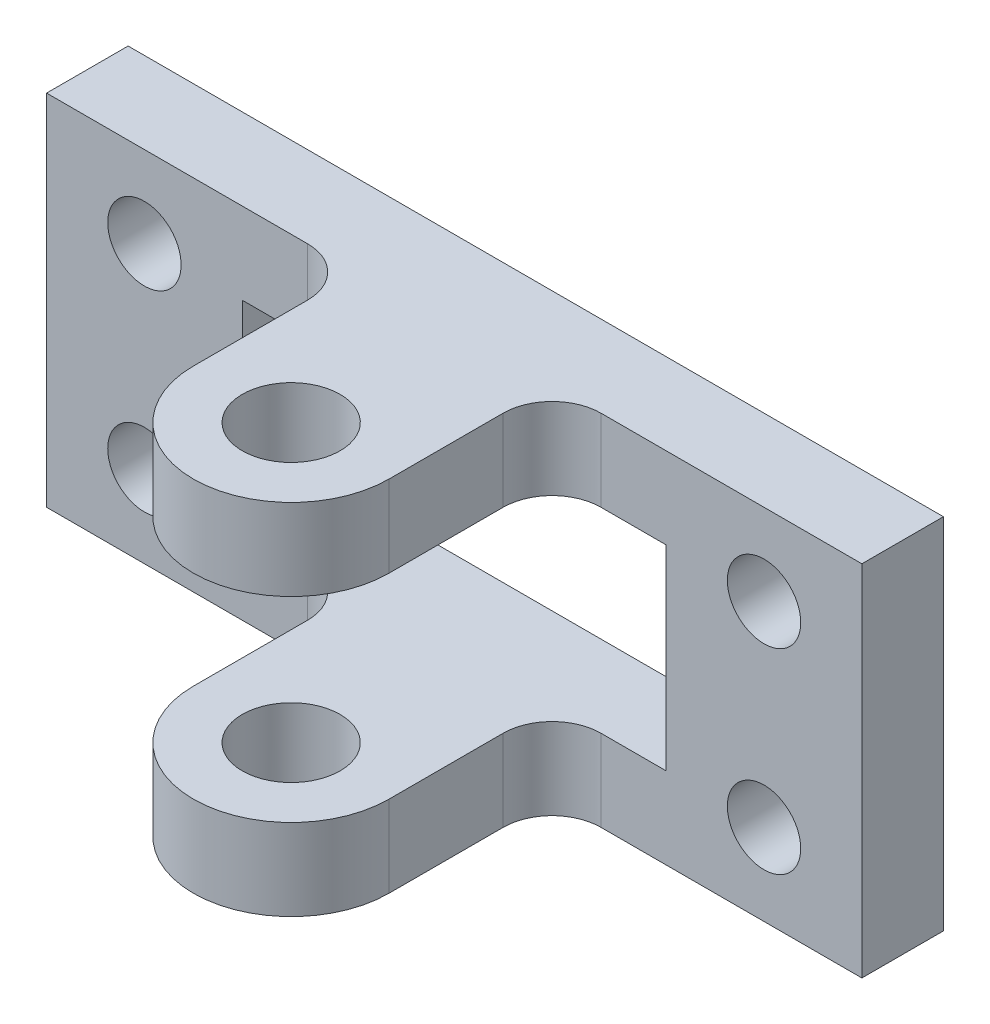
ISO-10303-21;
HEADER;
FILE_DESCRIPTION(('STEP AP214'),'2;1');
FILE_NAME('part.step','',(''),(''),'','','');
FILE_SCHEMA(('AUTOMOTIVE_DESIGN { 1 0 10303 214 1 1 1 1 }'));
ENDSEC;
DATA;
#1=APPLICATION_CONTEXT('core data for automotive mechanical design processes');
#2=APPLICATION_PROTOCOL_DEFINITION('international standard','automotive_design',2000,#1);
#3=PRODUCT_CONTEXT('',#1,'mechanical');
#4=PRODUCT('Part','Part','',(#3));
#5=PRODUCT_RELATED_PRODUCT_CATEGORY('part','',(#4));
#6=PRODUCT_DEFINITION_FORMATION('','',#4);
#7=PRODUCT_DEFINITION_CONTEXT('part definition',#1,'design');
#8=PRODUCT_DEFINITION('design','',#6,#7);
#9=PRODUCT_DEFINITION_SHAPE('','',#8);
#10=(LENGTH_UNIT() NAMED_UNIT(*) SI_UNIT(.MILLI.,.METRE.));
#11=(NAMED_UNIT(*) PLANE_ANGLE_UNIT() SI_UNIT($,.RADIAN.));
#12=(NAMED_UNIT(*) SI_UNIT($,.STERADIAN.) SOLID_ANGLE_UNIT());
#13=UNCERTAINTY_MEASURE_WITH_UNIT(LENGTH_MEASURE(1.E-05),#10,'distance_accuracy_value','');
#14=(GEOMETRIC_REPRESENTATION_CONTEXT(3) GLOBAL_UNCERTAINTY_ASSIGNED_CONTEXT((#13)) GLOBAL_UNIT_ASSIGNED_CONTEXT((#10,
#11,#12)) REPRESENTATION_CONTEXT('',''));
#15=CARTESIAN_POINT('',(0.,0.,0.));
#16=DIRECTION('',(0.,0.,1.));
#17=DIRECTION('',(1.,0.,0.));
#18=AXIS2_PLACEMENT_3D('',#15,#16,#17);
#19=CARTESIAN_POINT('',(6.,-6.,15.));
#20=DIRECTION('',(0.,1.,0.));
#21=DIRECTION('',(0.,0.,1.));
#22=AXIS2_PLACEMENT_3D('',#19,#20,#21);
#23=PLANE('',#22);
#24=CARTESIAN_POINT('',(0.,-6.,15.));
#25=DIRECTION('',(0.,1.,0.));
#26=DIRECTION('',(0.,0.,1.));
#27=AXIS2_PLACEMENT_3D('',#24,#25,#26);
#28=CIRCLE('',#27,2.99999999999999);
#29=CARTESIAN_POINT('',(0.,-6.,18.));
#30=VERTEX_POINT('',#29);
#31=EDGE_CURVE('E301',#30,#30,#28,.T.);
#32=ORIENTED_EDGE('',*,*,#31,.F.);
#33=EDGE_LOOP('',(#32));
#34=FACE_BOUND('',#33,.T.);
#35=DIRECTION('',(1.,0.,0.));
#36=VECTOR('',#35,1.);
#37=CARTESIAN_POINT('',(5.9999999999999,-6.,0.));
#38=LINE('',#37,#36);
#39=CARTESIAN_POINT('',(-13.,-6.,0.));
#40=VERTEX_POINT('',#39);
#41=CARTESIAN_POINT('',(13.,-6.,0.));
#42=VERTEX_POINT('',#41);
#43=EDGE_CURVE('E276',#40,#42,#38,.T.);
#44=ORIENTED_EDGE('',*,*,#43,.F.);
#45=DIRECTION('',(0.,0.,-1.));
#46=VECTOR('',#45,1.);
#47=CARTESIAN_POINT('',(-13.,-6.,0.));
#48=LINE('',#47,#46);
#49=CARTESIAN_POINT('',(-13.,-6.,5.));
#50=VERTEX_POINT('',#49);
#51=EDGE_CURVE('E192',#50,#40,#48,.T.);
#52=ORIENTED_EDGE('',*,*,#51,.F.);
#53=DIRECTION('',(1.,0.,0.));
#54=VECTOR('',#53,1.);
#55=CARTESIAN_POINT('',(-25.0000000000001,-6.,5.00000000000013));
#56=LINE('',#55,#54);
#57=CARTESIAN_POINT('',(-9.00000000000007,-6.,5.00000000000002));
#58=VERTEX_POINT('',#57);
#59=EDGE_CURVE('E270',#50,#58,#56,.T.);
#60=ORIENTED_EDGE('',*,*,#59,.T.);
#61=CARTESIAN_POINT('',(-9.00000000000005,-6.,8.00000000000002));
#62=DIRECTION('',(0.,1.,0.));
#63=DIRECTION('',(0.,0.,1.));
#64=AXIS2_PLACEMENT_3D('',#61,#62,#63);
#65=CIRCLE('',#64,3.);
#66=CARTESIAN_POINT('',(-6.00000000000005,-6.,8.));
#67=VERTEX_POINT('',#66);
#68=EDGE_CURVE('E340',#58,#67,#65,.F.);
#69=ORIENTED_EDGE('',*,*,#68,.T.);
#70=DIRECTION('',(0.,0.,1.));
#71=VECTOR('',#70,1.);
#72=CARTESIAN_POINT('',(-6.00000000000011,-6.,0.));
#73=LINE('',#72,#71);
#74=CARTESIAN_POINT('',(-6.,-6.,15.));
#75=VERTEX_POINT('',#74);
#76=EDGE_CURVE('E280',#67,#75,#73,.T.);
#77=ORIENTED_EDGE('',*,*,#76,.T.);
#78=CARTESIAN_POINT('',(0.,-6.,15.));
#79=DIRECTION('',(0.,-1.,0.));
#80=DIRECTION('',(0.,0.,-1.));
#81=AXIS2_PLACEMENT_3D('',#78,#79,#80);
#82=CIRCLE('',#81,6.);
#83=CARTESIAN_POINT('',(6.,-6.,15.));
#84=VERTEX_POINT('',#83);
#85=EDGE_CURVE('E297',#84,#75,#82,.T.);
#86=ORIENTED_EDGE('',*,*,#85,.F.);
#87=DIRECTION('',(0.,0.,1.));
#88=VECTOR('',#87,1.);
#89=CARTESIAN_POINT('',(5.9999999999999,-6.,0.));
#90=LINE('',#89,#88);
#91=CARTESIAN_POINT('',(5.99999999999995,-6.,8.));
#92=VERTEX_POINT('',#91);
#93=EDGE_CURVE('E286',#92,#84,#90,.T.);
#94=ORIENTED_EDGE('',*,*,#93,.F.);
#95=CARTESIAN_POINT('',(8.99999999999995,-6.,7.99999999999998));
#96=DIRECTION('',(0.,1.,0.));
#97=DIRECTION('',(0.,0.,1.));
#98=AXIS2_PLACEMENT_3D('',#95,#96,#97);
#99=CIRCLE('',#98,3.);
#100=CARTESIAN_POINT('',(8.99999999999993,-6.,4.99999999999998));
#101=VERTEX_POINT('',#100);
#102=EDGE_CURVE('E11',#92,#101,#99,.F.);
#103=ORIENTED_EDGE('',*,*,#102,.T.);
#104=DIRECTION('',(-1.,0.,0.));
#105=VECTOR('',#104,1.);
#106=CARTESIAN_POINT('',(24.9999999999999,-6.,4.99999999999987));
#107=LINE('',#106,#105);
#108=CARTESIAN_POINT('',(13.,-6.,5.));
#109=VERTEX_POINT('',#108);
#110=EDGE_CURVE('E260',#109,#101,#107,.T.);
#111=ORIENTED_EDGE('',*,*,#110,.F.);
#112=DIRECTION('',(0.,0.,1.));
#113=VECTOR('',#112,1.);
#114=CARTESIAN_POINT('',(13.,-6.,5.));
#115=LINE('',#114,#113);
#116=EDGE_CURVE('E239',#42,#109,#115,.T.);
#117=ORIENTED_EDGE('',*,*,#116,.F.);
#118=EDGE_LOOP('',(#44,#52,#60,#69,#77,#86,#94,#103,#111,#117));
#119=FACE_BOUND('',#118,.T.);
#120=ADVANCED_FACE('F36',(#34,#119),#23,.T.);
#121=CARTESIAN_POINT('',(5.9999999999999,-11.,0.));
#122=DIRECTION('',(-1.,0.,0.));
#123=DIRECTION('',(0.,0.,1.));
#124=AXIS2_PLACEMENT_3D('',#121,#122,#123);
#125=PLANE('',#124);
#126=DIRECTION('',(0.,0.,1.));
#127=VECTOR('',#126,1.);
#128=CARTESIAN_POINT('',(5.9999999999999,-11.,0.));
#129=LINE('',#128,#127);
#130=CARTESIAN_POINT('',(5.99999999999995,-11.,8.));
#131=VERTEX_POINT('',#130);
#132=CARTESIAN_POINT('',(6.,-11.,15.));
#133=VERTEX_POINT('',#132);
#134=EDGE_CURVE('E284',#131,#133,#129,.T.);
#135=ORIENTED_EDGE('',*,*,#134,.F.);
#136=DIRECTION('',(0.,-1.,0.));
#137=VECTOR('',#136,1.);
#138=CARTESIAN_POINT('',(5.99999999999995,-6.,8.));
#139=LINE('',#138,#137);
#140=EDGE_CURVE('E57',#131,#92,#139,.F.);
#141=ORIENTED_EDGE('',*,*,#140,.T.);
#142=ORIENTED_EDGE('',*,*,#93,.T.);
#143=DIRECTION('',(0.,1.,0.));
#144=VECTOR('',#143,1.);
#145=CARTESIAN_POINT('',(6.,-11.,15.));
#146=LINE('',#145,#144);
#147=EDGE_CURVE('E291',#133,#84,#146,.T.);
#148=ORIENTED_EDGE('',*,*,#147,.F.);
#149=EDGE_LOOP('',(#135,#141,#142,#148));
#150=FACE_BOUND('',#149,.T.);
#151=ADVANCED_FACE('F399',(#150),#125,.F.);
#152=CARTESIAN_POINT('',(-6.00000000000011,-6.,0.));
#153=DIRECTION('',(1.,0.,0.));
#154=DIRECTION('',(0.,0.,-1.));
#155=AXIS2_PLACEMENT_3D('',#152,#153,#154);
#156=PLANE('',#155);
#157=ORIENTED_EDGE('',*,*,#76,.F.);
#158=DIRECTION('',(0.,1.,0.));
#159=VECTOR('',#158,1.);
#160=CARTESIAN_POINT('',(-6.00000000000005,-11.,8.));
#161=LINE('',#160,#159);
#162=CARTESIAN_POINT('',(-6.00000000000005,-11.,8.));
#163=VERTEX_POINT('',#162);
#164=EDGE_CURVE('E330',#67,#163,#161,.F.);
#165=ORIENTED_EDGE('',*,*,#164,.T.);
#166=DIRECTION('',(0.,0.,1.));
#167=VECTOR('',#166,1.);
#168=CARTESIAN_POINT('',(-6.00000000000011,-11.,0.));
#169=LINE('',#168,#167);
#170=CARTESIAN_POINT('',(-6.,-11.,15.));
#171=VERTEX_POINT('',#170);
#172=EDGE_CURVE('E282',#163,#171,#169,.T.);
#173=ORIENTED_EDGE('',*,*,#172,.T.);
#174=DIRECTION('',(0.,1.,0.));
#175=VECTOR('',#174,1.);
#176=CARTESIAN_POINT('',(-6.,-11.,15.));
#177=LINE('',#176,#175);
#178=EDGE_CURVE('E288',#171,#75,#177,.T.);
#179=ORIENTED_EDGE('',*,*,#178,.T.);
#180=EDGE_LOOP('',(#157,#165,#173,#179));
#181=FACE_BOUND('',#180,.T.);
#182=ADVANCED_FACE('F363',(#181),#156,.F.);
#183=CARTESIAN_POINT('',(0.,-6.,15.));
#184=DIRECTION('',(0.,-1.,0.));
#185=DIRECTION('',(0.,0.,-1.));
#186=AXIS2_PLACEMENT_3D('',#183,#184,#185);
#187=CYLINDRICAL_SURFACE('',#186,6.);
#188=ORIENTED_EDGE('',*,*,#85,.T.);
#189=ORIENTED_EDGE('',*,*,#178,.F.);
#190=CARTESIAN_POINT('',(0.,-11.,15.));
#191=DIRECTION('',(0.,-1.,0.));
#192=DIRECTION('',(0.,0.,-1.));
#193=AXIS2_PLACEMENT_3D('',#190,#191,#192);
#194=CIRCLE('',#193,6.);
#195=EDGE_CURVE('E294',#133,#171,#194,.T.);
#196=ORIENTED_EDGE('',*,*,#195,.F.);
#197=ORIENTED_EDGE('',*,*,#147,.T.);
#198=EDGE_LOOP('',(#188,#189,#196,#197));
#199=FACE_BOUND('',#198,.T.);
#200=ADVANCED_FACE('F367',(#199),#187,.T.);
#201=CARTESIAN_POINT('',(0.,-11.,15.));
#202=DIRECTION('',(0.,-1.,0.));
#203=DIRECTION('',(0.,0.,-1.));
#204=AXIS2_PLACEMENT_3D('',#201,#202,#203);
#205=PLANE('',#204);
#206=CARTESIAN_POINT('',(0.,-11.,15.));
#207=DIRECTION('',(0.,-1.,0.));
#208=DIRECTION('',(0.,0.,-1.));
#209=AXIS2_PLACEMENT_3D('',#206,#207,#208);
#210=CIRCLE('',#209,2.99999999999999);
#211=CARTESIAN_POINT('',(0.,-11.,12.));
#212=VERTEX_POINT('',#211);
#213=EDGE_CURVE('E305',#212,#212,#210,.T.);
#214=ORIENTED_EDGE('',*,*,#213,.F.);
#215=EDGE_LOOP('',(#214));
#216=FACE_BOUND('',#215,.T.);
#217=ORIENTED_EDGE('',*,*,#195,.T.);
#218=ORIENTED_EDGE('',*,*,#172,.F.);
#219=CARTESIAN_POINT('',(-9.00000000000005,-11.,8.00000000000002));
#220=DIRECTION('',(0.,-1.,0.));
#221=DIRECTION('',(0.,0.,-1.));
#222=AXIS2_PLACEMENT_3D('',#219,#220,#221);
#223=CIRCLE('',#222,3.);
#224=CARTESIAN_POINT('',(-9.00000000000007,-11.,5.00000000000002));
#225=VERTEX_POINT('',#224);
#226=EDGE_CURVE('E342',#163,#225,#223,.F.);
#227=ORIENTED_EDGE('',*,*,#226,.T.);
#228=DIRECTION('',(1.,0.,0.));
#229=VECTOR('',#228,1.);
#230=CARTESIAN_POINT('',(-25.0000000000001,-11.,5.00000000000013));
#231=LINE('',#230,#229);
#232=CARTESIAN_POINT('',(-25.0000000000001,-11.,5.00000000000013));
#233=VERTEX_POINT('',#232);
#234=EDGE_CURVE('E273',#233,#225,#231,.T.);
#235=ORIENTED_EDGE('',*,*,#234,.F.);
#236=DIRECTION('',(0.,0.,1.));
#237=VECTOR('',#236,1.);
#238=CARTESIAN_POINT('',(-25.0000000000001,-11.,5.00000000000013));
#239=LINE('',#238,#237);
#240=CARTESIAN_POINT('',(-25.0000000000001,-11.,1.3267629087604E-13));
#241=VERTEX_POINT('',#240);
#242=EDGE_CURVE('E266',#241,#233,#239,.T.);
#243=ORIENTED_EDGE('',*,*,#242,.F.);
#244=DIRECTION('',(-1.,0.,0.));
#245=VECTOR('',#244,1.);
#246=CARTESIAN_POINT('',(-6.00000000000011,-11.,0.));
#247=LINE('',#246,#245);
#248=CARTESIAN_POINT('',(24.9999999999999,-11.,-1.32676290876038E-13));
#249=VERTEX_POINT('',#248);
#250=EDGE_CURVE('E278',#249,#241,#247,.T.);
#251=ORIENTED_EDGE('',*,*,#250,.F.);
#252=DIRECTION('',(0.,0.,-1.));
#253=VECTOR('',#252,1.);
#254=CARTESIAN_POINT('',(24.9999999999999,-11.,-1.32676290876038E-13));
#255=LINE('',#254,#253);
#256=CARTESIAN_POINT('',(24.9999999999999,-11.,4.99999999999987));
#257=VERTEX_POINT('',#256);
#258=EDGE_CURVE('E253',#257,#249,#255,.T.);
#259=ORIENTED_EDGE('',*,*,#258,.F.);
#260=DIRECTION('',(-1.,0.,0.));
#261=VECTOR('',#260,1.);
#262=CARTESIAN_POINT('',(24.9999999999999,-11.,4.99999999999987));
#263=LINE('',#262,#261);
#264=CARTESIAN_POINT('',(8.99999999999993,-11.,4.99999999999998));
#265=VERTEX_POINT('',#264);
#266=EDGE_CURVE('E258',#257,#265,#263,.T.);
#267=ORIENTED_EDGE('',*,*,#266,.T.);
#268=CARTESIAN_POINT('',(8.99999999999995,-11.,7.99999999999998));
#269=DIRECTION('',(0.,-1.,0.));
#270=DIRECTION('',(0.,0.,-1.));
#271=AXIS2_PLACEMENT_3D('',#268,#269,#270);
#272=CIRCLE('',#271,3.);
#273=EDGE_CURVE('E44',#265,#131,#272,.F.);
#274=ORIENTED_EDGE('',*,*,#273,.T.);
#275=ORIENTED_EDGE('',*,*,#134,.T.);
#276=EDGE_LOOP('',(#217,#218,#227,#235,#243,#251,#259,#267,#274,#275));
#277=FACE_BOUND('',#276,.T.);
#278=ADVANCED_FACE('F346',(#216,#277),#205,.T.);
#279=CARTESIAN_POINT('',(0.,0.,0.));
#280=DIRECTION('',(0.,0.,1.));
#281=DIRECTION('',(1.,0.,0.));
#282=AXIS2_PLACEMENT_3D('',#279,#280,#281);
#283=PLANE('',#282);
#284=CARTESIAN_POINT('',(19.,-6.,0.));
#285=DIRECTION('',(0.,0.,-1.));
#286=DIRECTION('',(-1.,0.,0.));
#287=AXIS2_PLACEMENT_3D('',#284,#285,#286);
#288=CIRCLE('',#287,2.25);
#289=CARTESIAN_POINT('',(16.75,-6.,0.));
#290=VERTEX_POINT('',#289);
#291=EDGE_CURVE('E315',#290,#290,#288,.T.);
#292=ORIENTED_EDGE('',*,*,#291,.F.);
#293=EDGE_LOOP('',(#292));
#294=FACE_BOUND('',#293,.T.);
#295=CARTESIAN_POINT('',(-19.,6.,0.));
#296=DIRECTION('',(0.,0.,-1.));
#297=DIRECTION('',(-1.,0.,0.));
#298=AXIS2_PLACEMENT_3D('',#295,#296,#297);
#299=CIRCLE('',#298,2.25);
#300=CARTESIAN_POINT('',(-21.25,6.,0.));
#301=VERTEX_POINT('',#300);
#302=EDGE_CURVE('E314',#301,#301,#299,.T.);
#303=ORIENTED_EDGE('',*,*,#302,.F.);
#304=EDGE_LOOP('',(#303));
#305=FACE_BOUND('',#304,.T.);
#306=CARTESIAN_POINT('',(-19.,-6.,0.));
#307=DIRECTION('',(0.,0.,-1.));
#308=DIRECTION('',(-1.,0.,0.));
#309=AXIS2_PLACEMENT_3D('',#306,#307,#308);
#310=CIRCLE('',#309,2.25);
#311=CARTESIAN_POINT('',(-21.25,-6.,0.));
#312=VERTEX_POINT('',#311);
#313=EDGE_CURVE('E310',#312,#312,#310,.T.);
#314=ORIENTED_EDGE('',*,*,#313,.F.);
#315=EDGE_LOOP('',(#314));
#316=FACE_BOUND('',#315,.T.);
#317=CARTESIAN_POINT('',(19.,6.,0.));
#318=DIRECTION('',(0.,0.,-1.));
#319=DIRECTION('',(-1.,0.,0.));
#320=AXIS2_PLACEMENT_3D('',#317,#318,#319);
#321=CIRCLE('',#320,2.25);
#322=CARTESIAN_POINT('',(16.75,6.,0.));
#323=VERTEX_POINT('',#322);
#324=EDGE_CURVE('E309',#323,#323,#321,.T.);
#325=ORIENTED_EDGE('',*,*,#324,.F.);
#326=EDGE_LOOP('',(#325));
#327=FACE_BOUND('',#326,.T.);
#328=DIRECTION('',(0.,-1.,0.));
#329=VECTOR('',#328,1.);
#330=CARTESIAN_POINT('',(13.,6.00000000000001,0.));
#331=LINE('',#330,#329);
#332=CARTESIAN_POINT('',(13.,6.,0.));
#333=VERTEX_POINT('',#332);
#334=EDGE_CURVE('E248',#333,#42,#331,.T.);
#335=ORIENTED_EDGE('',*,*,#334,.F.);
#336=DIRECTION('',(-1.,0.,0.));
#337=VECTOR('',#336,1.);
#338=CARTESIAN_POINT('',(-25.,6.,0.));
#339=LINE('',#338,#337);
#340=CARTESIAN_POINT('',(-13.,6.,0.));
#341=VERTEX_POINT('',#340);
#342=EDGE_CURVE('E226',#333,#341,#339,.T.);
#343=ORIENTED_EDGE('',*,*,#342,.T.);
#344=DIRECTION('',(0.,-1.,0.));
#345=VECTOR('',#344,1.);
#346=CARTESIAN_POINT('',(-13.,6.,0.));
#347=LINE('',#346,#345);
#348=EDGE_CURVE('E233',#341,#40,#347,.T.);
#349=ORIENTED_EDGE('',*,*,#348,.T.);
#350=ORIENTED_EDGE('',*,*,#43,.T.);
#351=EDGE_LOOP('',(#335,#343,#349,#350));
#352=FACE_BOUND('',#351,.T.);
#353=DIRECTION('',(0.,-1.,0.));
#354=VECTOR('',#353,1.);
#355=CARTESIAN_POINT('',(-25.0000000000001,-11.,1.3267629087604E-13));
#356=LINE('',#355,#354);
#357=CARTESIAN_POINT('',(-25.,11.,0.));
#358=VERTEX_POINT('',#357);
#359=EDGE_CURVE('E263',#358,#241,#356,.T.);
#360=ORIENTED_EDGE('',*,*,#359,.F.);
#361=DIRECTION('',(-1.,0.,0.));
#362=VECTOR('',#361,1.);
#363=CARTESIAN_POINT('',(-25.,11.,0.));
#364=LINE('',#363,#362);
#365=CARTESIAN_POINT('',(25.,11.,0.));
#366=VERTEX_POINT('',#365);
#367=EDGE_CURVE('E208',#366,#358,#364,.T.);
#368=ORIENTED_EDGE('',*,*,#367,.F.);
#369=DIRECTION('',(0.,1.,0.));
#370=VECTOR('',#369,1.);
#371=CARTESIAN_POINT('',(24.9999999999999,-6.,-1.32676290876038E-13));
#372=LINE('',#371,#370);
#373=EDGE_CURVE('E256',#249,#366,#372,.T.);
#374=ORIENTED_EDGE('',*,*,#373,.F.);
#375=ORIENTED_EDGE('',*,*,#250,.T.);
#376=EDGE_LOOP('',(#360,#368,#374,#375));
#377=FACE_BOUND('',#376,.T.);
#378=ADVANCED_FACE('F384',(#294,#305,#316,#327,#352,#377),#283,.F.);
#379=CARTESIAN_POINT('',(-25.0000000000001,-6.,5.00000000000013));
#380=DIRECTION('',(0.,0.,-1.));
#381=DIRECTION('',(-1.,0.,0.));
#382=AXIS2_PLACEMENT_3D('',#379,#380,#381);
#383=PLANE('',#382);
#384=CARTESIAN_POINT('',(-19.,6.,5.00000000000009));
#385=DIRECTION('',(0.,0.,-1.));
#386=DIRECTION('',(-1.,0.,0.));
#387=AXIS2_PLACEMENT_3D('',#384,#385,#386);
#388=CIRCLE('',#387,2.25);
#389=CARTESIAN_POINT('',(-21.25,6.,5.00000000000011));
#390=VERTEX_POINT('',#389);
#391=EDGE_CURVE('E717',#390,#390,#388,.T.);
#392=ORIENTED_EDGE('',*,*,#391,.T.);
#393=EDGE_LOOP('',(#392));
#394=FACE_BOUND('',#393,.T.);
#395=CARTESIAN_POINT('',(-19.,-6.,5.00000000000009));
#396=DIRECTION('',(0.,0.,-1.));
#397=DIRECTION('',(-1.,0.,0.));
#398=AXIS2_PLACEMENT_3D('',#395,#396,#397);
#399=CIRCLE('',#398,2.25);
#400=CARTESIAN_POINT('',(-21.25,-6.,5.00000000000011));
#401=VERTEX_POINT('',#400);
#402=EDGE_CURVE('E306',#401,#401,#399,.T.);
#403=ORIENTED_EDGE('',*,*,#402,.T.);
#404=EDGE_LOOP('',(#403));
#405=FACE_BOUND('',#404,.T.);
#406=DIRECTION('',(1.,0.,0.));
#407=VECTOR('',#406,1.);
#408=CARTESIAN_POINT('',(-6.,6.,5.));
#409=LINE('',#408,#407);
#410=CARTESIAN_POINT('',(-13.,6.,5.));
#411=VERTEX_POINT('',#410);
#412=CARTESIAN_POINT('',(-9.00000000000002,6.,5.));
#413=VERTEX_POINT('',#412);
#414=EDGE_CURVE('E214',#411,#413,#409,.T.);
#415=ORIENTED_EDGE('',*,*,#414,.T.);
#416=DIRECTION('',(0.,-1.,0.));
#417=VECTOR('',#416,1.);
#418=CARTESIAN_POINT('',(-9.00000000000002,11.,5.00000000000002));
#419=LINE('',#418,#417);
#420=CARTESIAN_POINT('',(-9.00000000000002,11.,5.));
#421=VERTEX_POINT('',#420);
#422=EDGE_CURVE('E320',#413,#421,#419,.F.);
#423=ORIENTED_EDGE('',*,*,#422,.T.);
#424=DIRECTION('',(1.,0.,0.));
#425=VECTOR('',#424,1.);
#426=CARTESIAN_POINT('',(-6.,11.,5.));
#427=LINE('',#426,#425);
#428=CARTESIAN_POINT('',(-25.,11.,5.));
#429=VERTEX_POINT('',#428);
#430=EDGE_CURVE('E183',#429,#421,#427,.T.);
#431=ORIENTED_EDGE('',*,*,#430,.F.);
#432=DIRECTION('',(0.,1.,0.));
#433=VECTOR('',#432,1.);
#434=CARTESIAN_POINT('',(-25.0000000000001,-6.,5.00000000000013));
#435=LINE('',#434,#433);
#436=EDGE_CURVE('E268',#233,#429,#435,.T.);
#437=ORIENTED_EDGE('',*,*,#436,.F.);
#438=ORIENTED_EDGE('',*,*,#234,.T.);
#439=DIRECTION('',(0.,1.,0.));
#440=VECTOR('',#439,1.);
#441=CARTESIAN_POINT('',(-9.00000000000007,-6.,5.00000000000002));
#442=LINE('',#441,#440);
#443=EDGE_CURVE('E317',#225,#58,#442,.T.);
#444=ORIENTED_EDGE('',*,*,#443,.T.);
#445=ORIENTED_EDGE('',*,*,#59,.F.);
#446=DIRECTION('',(0.,-1.,0.));
#447=VECTOR('',#446,1.);
#448=CARTESIAN_POINT('',(-13.,6.,5.));
#449=LINE('',#448,#447);
#450=EDGE_CURVE('E237',#411,#50,#449,.T.);
#451=ORIENTED_EDGE('',*,*,#450,.F.);
#452=EDGE_LOOP('',(#415,#423,#431,#437,#438,#444,#445,#451));
#453=FACE_BOUND('',#452,.T.);
#454=ADVANCED_FACE('F353',(#394,#405,#453),#383,.F.);
#455=CARTESIAN_POINT('',(-25.0000000000001,0.,1.74309654299483E-13));
#456=DIRECTION('',(1.,0.,0.));
#457=DIRECTION('',(0.,0.,-1.));
#458=AXIS2_PLACEMENT_3D('',#455,#456,#457);
#459=PLANE('',#458);
#460=ORIENTED_EDGE('',*,*,#436,.T.);
#461=DIRECTION('',(0.,0.,1.));
#462=VECTOR('',#461,1.);
#463=CARTESIAN_POINT('',(-25.,11.,5.));
#464=LINE('',#463,#462);
#465=EDGE_CURVE('E211',#358,#429,#464,.T.);
#466=ORIENTED_EDGE('',*,*,#465,.F.);
#467=ORIENTED_EDGE('',*,*,#359,.T.);
#468=ORIENTED_EDGE('',*,*,#242,.T.);
#469=EDGE_LOOP('',(#460,#466,#467,#468));
#470=FACE_BOUND('',#469,.T.);
#471=ADVANCED_FACE('F387',(#470),#459,.F.);
#472=CARTESIAN_POINT('',(24.9999999999999,-11.,4.99999999999987));
#473=DIRECTION('',(0.,0.,-1.));
#474=DIRECTION('',(-1.,0.,0.));
#475=AXIS2_PLACEMENT_3D('',#472,#473,#474);
#476=PLANE('',#475);
#477=CARTESIAN_POINT('',(19.,-6.,4.99999999999991));
#478=DIRECTION('',(0.,0.,-1.));
#479=DIRECTION('',(-1.,0.,0.));
#480=AXIS2_PLACEMENT_3D('',#477,#478,#479);
#481=CIRCLE('',#480,2.25);
#482=CARTESIAN_POINT('',(16.75,-6.,4.99999999999992));
#483=VERTEX_POINT('',#482);
#484=EDGE_CURVE('E311',#483,#483,#481,.T.);
#485=ORIENTED_EDGE('',*,*,#484,.T.);
#486=EDGE_LOOP('',(#485));
#487=FACE_BOUND('',#486,.T.);
#488=CARTESIAN_POINT('',(19.,6.,4.99999999999991));
#489=DIRECTION('',(0.,0.,-1.));
#490=DIRECTION('',(-1.,0.,0.));
#491=AXIS2_PLACEMENT_3D('',#488,#489,#490);
#492=CIRCLE('',#491,2.25);
#493=CARTESIAN_POINT('',(16.75,6.,4.99999999999992));
#494=VERTEX_POINT('',#493);
#495=EDGE_CURVE('E710',#494,#494,#492,.T.);
#496=ORIENTED_EDGE('',*,*,#495,.T.);
#497=EDGE_LOOP('',(#496));
#498=FACE_BOUND('',#497,.T.);
#499=DIRECTION('',(1.,0.,0.));
#500=VECTOR('',#499,1.);
#501=CARTESIAN_POINT('',(25.,11.,5.));
#502=LINE('',#501,#500);
#503=CARTESIAN_POINT('',(8.99999999999998,11.,5.));
#504=VERTEX_POINT('',#503);
#505=CARTESIAN_POINT('',(25.,11.,5.));
#506=VERTEX_POINT('',#505);
#507=EDGE_CURVE('E200',#504,#506,#502,.T.);
#508=ORIENTED_EDGE('',*,*,#507,.F.);
#509=DIRECTION('',(0.,-1.,0.));
#510=VECTOR('',#509,1.);
#511=CARTESIAN_POINT('',(8.99999999999998,6.,4.99999999999998));
#512=LINE('',#511,#510);
#513=CARTESIAN_POINT('',(8.99999999999998,6.,5.));
#514=VERTEX_POINT('',#513);
#515=EDGE_CURVE('E325',#504,#514,#512,.T.);
#516=ORIENTED_EDGE('',*,*,#515,.T.);
#517=DIRECTION('',(1.,0.,0.));
#518=VECTOR('',#517,1.);
#519=CARTESIAN_POINT('',(25.,6.,5.));
#520=LINE('',#519,#518);
#521=CARTESIAN_POINT('',(13.,6.00000000000001,5.));
#522=VERTEX_POINT('',#521);
#523=EDGE_CURVE('E224',#514,#522,#520,.T.);
#524=ORIENTED_EDGE('',*,*,#523,.T.);
#525=DIRECTION('',(0.,-1.,0.));
#526=VECTOR('',#525,1.);
#527=CARTESIAN_POINT('',(13.,6.00000000000001,5.));
#528=LINE('',#527,#526);
#529=EDGE_CURVE('E243',#522,#109,#528,.T.);
#530=ORIENTED_EDGE('',*,*,#529,.T.);
#531=ORIENTED_EDGE('',*,*,#110,.T.);
#532=DIRECTION('',(0.,-1.,0.));
#533=VECTOR('',#532,1.);
#534=CARTESIAN_POINT('',(8.99999999999993,-11.,4.99999999999998));
#535=LINE('',#534,#533);
#536=EDGE_CURVE('E322',#101,#265,#535,.T.);
#537=ORIENTED_EDGE('',*,*,#536,.T.);
#538=ORIENTED_EDGE('',*,*,#266,.F.);
#539=DIRECTION('',(0.,-1.,0.));
#540=VECTOR('',#539,1.);
#541=CARTESIAN_POINT('',(24.9999999999999,-11.,4.99999999999987));
#542=LINE('',#541,#540);
#543=EDGE_CURVE('E251',#506,#257,#542,.T.);
#544=ORIENTED_EDGE('',*,*,#543,.F.);
#545=EDGE_LOOP('',(#508,#516,#524,#530,#531,#537,#538,#544));
#546=FACE_BOUND('',#545,.T.);
#547=ADVANCED_FACE('F375',(#487,#498,#546),#476,.F.);
#548=CARTESIAN_POINT('',(24.9999999999999,0.,-1.74309654299482E-13));
#549=DIRECTION('',(-1.,0.,0.));
#550=DIRECTION('',(0.,0.,1.));
#551=AXIS2_PLACEMENT_3D('',#548,#549,#550);
#552=PLANE('',#551);
#553=ORIENTED_EDGE('',*,*,#373,.T.);
#554=DIRECTION('',(0.,0.,-1.));
#555=VECTOR('',#554,1.);
#556=CARTESIAN_POINT('',(25.,11.,0.));
#557=LINE('',#556,#555);
#558=EDGE_CURVE('E205',#506,#366,#557,.T.);
#559=ORIENTED_EDGE('',*,*,#558,.F.);
#560=ORIENTED_EDGE('',*,*,#543,.T.);
#561=ORIENTED_EDGE('',*,*,#258,.T.);
#562=EDGE_LOOP('',(#553,#559,#560,#561));
#563=FACE_BOUND('',#562,.T.);
#564=ADVANCED_FACE('F380',(#563),#552,.F.);
#565=CARTESIAN_POINT('',(13.,6.00000000000001,5.));
#566=DIRECTION('',(1.,0.,0.));
#567=DIRECTION('',(0.,0.,-1.));
#568=AXIS2_PLACEMENT_3D('',#565,#566,#567);
#569=PLANE('',#568);
#570=ORIENTED_EDGE('',*,*,#116,.T.);
#571=ORIENTED_EDGE('',*,*,#529,.F.);
#572=DIRECTION('',(0.,0.,1.));
#573=VECTOR('',#572,1.);
#574=CARTESIAN_POINT('',(13.,6.00000000000001,5.));
#575=LINE('',#574,#573);
#576=EDGE_CURVE('E240',#333,#522,#575,.T.);
#577=ORIENTED_EDGE('',*,*,#576,.F.);
#578=ORIENTED_EDGE('',*,*,#334,.T.);
#579=EDGE_LOOP('',(#570,#571,#577,#578));
#580=FACE_BOUND('',#579,.T.);
#581=ADVANCED_FACE('F613',(#580),#569,.F.);
#582=CARTESIAN_POINT('',(-13.,6.,0.));
#583=DIRECTION('',(-1.,0.,0.));
#584=DIRECTION('',(0.,0.,1.));
#585=AXIS2_PLACEMENT_3D('',#582,#583,#584);
#586=PLANE('',#585);
#587=ORIENTED_EDGE('',*,*,#51,.T.);
#588=ORIENTED_EDGE('',*,*,#348,.F.);
#589=DIRECTION('',(0.,0.,-1.));
#590=VECTOR('',#589,1.);
#591=CARTESIAN_POINT('',(-13.,6.,0.));
#592=LINE('',#591,#590);
#593=EDGE_CURVE('E230',#411,#341,#592,.T.);
#594=ORIENTED_EDGE('',*,*,#593,.F.);
#595=ORIENTED_EDGE('',*,*,#450,.T.);
#596=EDGE_LOOP('',(#587,#588,#594,#595));
#597=FACE_BOUND('',#596,.T.);
#598=ADVANCED_FACE('F484',(#597),#586,.F.);
#599=CARTESIAN_POINT('',(0.,6.,15.));
#600=DIRECTION('',(0.,-1.,0.));
#601=DIRECTION('',(0.,0.,-1.));
#602=AXIS2_PLACEMENT_3D('',#599,#600,#601);
#603=PLANE('',#602);
#604=CARTESIAN_POINT('',(0.,6.,15.));
#605=DIRECTION('',(0.,-1.,0.));
#606=DIRECTION('',(0.,0.,-1.));
#607=AXIS2_PLACEMENT_3D('',#604,#605,#606);
#608=CIRCLE('',#607,2.99999999999999);
#609=CARTESIAN_POINT('',(0.,6.,12.));
#610=VERTEX_POINT('',#609);
#611=EDGE_CURVE('E304',#610,#610,#608,.T.);
#612=ORIENTED_EDGE('',*,*,#611,.F.);
#613=EDGE_LOOP('',(#612));
#614=FACE_BOUND('',#613,.T.);
#615=ORIENTED_EDGE('',*,*,#576,.T.);
#616=ORIENTED_EDGE('',*,*,#523,.F.);
#617=CARTESIAN_POINT('',(9.,6.,7.99999999999998));
#618=DIRECTION('',(0.,-1.,0.));
#619=DIRECTION('',(0.,0.,-1.));
#620=AXIS2_PLACEMENT_3D('',#617,#618,#619);
#621=CIRCLE('',#620,3.);
#622=CARTESIAN_POINT('',(6.,6.,7.99999999999998));
#623=VERTEX_POINT('',#622);
#624=EDGE_CURVE('E336',#514,#623,#621,.F.);
#625=ORIENTED_EDGE('',*,*,#624,.T.);
#626=DIRECTION('',(0.,0.,-1.));
#627=VECTOR('',#626,1.);
#628=CARTESIAN_POINT('',(6.,6.,5.));
#629=LINE('',#628,#627);
#630=CARTESIAN_POINT('',(6.,6.,15.));
#631=VERTEX_POINT('',#630);
#632=EDGE_CURVE('E221',#631,#623,#629,.T.);
#633=ORIENTED_EDGE('',*,*,#632,.F.);
#634=CARTESIAN_POINT('',(0.,6.,15.));
#635=DIRECTION('',(0.,1.,0.));
#636=DIRECTION('',(0.,0.,-1.));
#637=AXIS2_PLACEMENT_3D('',#634,#635,#636);
#638=CIRCLE('',#637,6.);
#639=CARTESIAN_POINT('',(-6.,6.,15.));
#640=VERTEX_POINT('',#639);
#641=EDGE_CURVE('E219',#640,#631,#638,.T.);
#642=ORIENTED_EDGE('',*,*,#641,.F.);
#643=DIRECTION('',(0.,0.,1.));
#644=VECTOR('',#643,1.);
#645=CARTESIAN_POINT('',(-6.,6.,15.));
#646=LINE('',#645,#644);
#647=CARTESIAN_POINT('',(-6.,6.,8.00000000000002));
#648=VERTEX_POINT('',#647);
#649=EDGE_CURVE('E189',#648,#640,#646,.T.);
#650=ORIENTED_EDGE('',*,*,#649,.F.);
#651=CARTESIAN_POINT('',(-9.,6.,8.00000000000002));
#652=DIRECTION('',(0.,-1.,0.));
#653=DIRECTION('',(0.,0.,-1.));
#654=AXIS2_PLACEMENT_3D('',#651,#652,#653);
#655=CIRCLE('',#654,3.);
#656=EDGE_CURVE('E333',#648,#413,#655,.F.);
#657=ORIENTED_EDGE('',*,*,#656,.T.);
#658=ORIENTED_EDGE('',*,*,#414,.F.);
#659=ORIENTED_EDGE('',*,*,#593,.T.);
#660=ORIENTED_EDGE('',*,*,#342,.F.);
#661=EDGE_LOOP('',(#615,#616,#625,#633,#642,#650,#657,#658,#659,#660));
#662=FACE_BOUND('',#661,.T.);
#663=ADVANCED_FACE('F475',(#614,#662),#603,.T.);
#664=CARTESIAN_POINT('',(-6.,11.,15.));
#665=DIRECTION('',(1.,0.,0.));
#666=DIRECTION('',(0.,0.,-1.));
#667=AXIS2_PLACEMENT_3D('',#664,#665,#666);
#668=PLANE('',#667);
#669=DIRECTION('',(0.,0.,1.));
#670=VECTOR('',#669,1.);
#671=CARTESIAN_POINT('',(-6.,11.,15.));
#672=LINE('',#671,#670);
#673=CARTESIAN_POINT('',(-6.,11.,8.00000000000002));
#674=VERTEX_POINT('',#673);
#675=CARTESIAN_POINT('',(-6.,11.,15.));
#676=VERTEX_POINT('',#675);
#677=EDGE_CURVE('E170',#674,#676,#672,.T.);
#678=ORIENTED_EDGE('',*,*,#677,.F.);
#679=DIRECTION('',(0.,-1.,0.));
#680=VECTOR('',#679,1.);
#681=CARTESIAN_POINT('',(-6.,6.,8.00000000000002));
#682=LINE('',#681,#680);
#683=EDGE_CURVE('E300',#674,#648,#682,.T.);
#684=ORIENTED_EDGE('',*,*,#683,.T.);
#685=ORIENTED_EDGE('',*,*,#649,.T.);
#686=DIRECTION('',(0.,-1.,0.));
#687=VECTOR('',#686,1.);
#688=CARTESIAN_POINT('',(-6.,11.,15.));
#689=LINE('',#688,#687);
#690=EDGE_CURVE('E186',#676,#640,#689,.T.);
#691=ORIENTED_EDGE('',*,*,#690,.F.);
#692=EDGE_LOOP('',(#678,#684,#685,#691));
#693=FACE_BOUND('',#692,.T.);
#694=ADVANCED_FACE('F187',(#693),#668,.F.);
#695=CARTESIAN_POINT('',(0.,11.,15.));
#696=DIRECTION('',(0.,-1.,0.));
#697=DIRECTION('',(0.,0.,-1.));
#698=AXIS2_PLACEMENT_3D('',#695,#696,#697);
#699=CYLINDRICAL_SURFACE('',#698,6.);
#700=ORIENTED_EDGE('',*,*,#641,.T.);
#701=DIRECTION('',(0.,-1.,0.));
#702=VECTOR('',#701,1.);
#703=CARTESIAN_POINT('',(6.,11.,15.));
#704=LINE('',#703,#702);
#705=CARTESIAN_POINT('',(6.,11.,15.));
#706=VERTEX_POINT('',#705);
#707=EDGE_CURVE('E193',#706,#631,#704,.T.);
#708=ORIENTED_EDGE('',*,*,#707,.F.);
#709=CARTESIAN_POINT('',(0.,11.,15.));
#710=DIRECTION('',(0.,1.,0.));
#711=DIRECTION('',(0.,0.,-1.));
#712=AXIS2_PLACEMENT_3D('',#709,#710,#711);
#713=CIRCLE('',#712,6.);
#714=EDGE_CURVE('E176',#676,#706,#713,.T.);
#715=ORIENTED_EDGE('',*,*,#714,.F.);
#716=ORIENTED_EDGE('',*,*,#690,.T.);
#717=EDGE_LOOP('',(#700,#708,#715,#716));
#718=FACE_BOUND('',#717,.T.);
#719=ADVANCED_FACE('F195',(#718),#699,.T.);
#720=CARTESIAN_POINT('',(6.,11.,5.));
#721=DIRECTION('',(-1.,0.,0.));
#722=DIRECTION('',(0.,0.,1.));
#723=AXIS2_PLACEMENT_3D('',#720,#721,#722);
#724=PLANE('',#723);
#725=ORIENTED_EDGE('',*,*,#632,.T.);
#726=DIRECTION('',(0.,-1.,0.));
#727=VECTOR('',#726,1.);
#728=CARTESIAN_POINT('',(6.,11.,7.99999999999998));
#729=LINE('',#728,#727);
#730=CARTESIAN_POINT('',(6.,11.,7.99999999999998));
#731=VERTEX_POINT('',#730);
#732=EDGE_CURVE('E328',#623,#731,#729,.F.);
#733=ORIENTED_EDGE('',*,*,#732,.T.);
#734=DIRECTION('',(0.,0.,-1.));
#735=VECTOR('',#734,1.);
#736=CARTESIAN_POINT('',(6.,11.,5.));
#737=LINE('',#736,#735);
#738=EDGE_CURVE('E198',#706,#731,#737,.T.);
#739=ORIENTED_EDGE('',*,*,#738,.F.);
#740=ORIENTED_EDGE('',*,*,#707,.T.);
#741=EDGE_LOOP('',(#725,#733,#739,#740));
#742=FACE_BOUND('',#741,.T.);
#743=ADVANCED_FACE('F452',(#742),#724,.F.);
#744=CARTESIAN_POINT('',(0.,11.,15.));
#745=DIRECTION('',(0.,-1.,0.));
#746=DIRECTION('',(0.,0.,-1.));
#747=AXIS2_PLACEMENT_3D('',#744,#745,#746);
#748=PLANE('',#747);
#749=CARTESIAN_POINT('',(0.,11.,15.));
#750=DIRECTION('',(0.,-1.,0.));
#751=DIRECTION('',(0.,0.,-1.));
#752=AXIS2_PLACEMENT_3D('',#749,#750,#751);
#753=CIRCLE('',#752,2.99999999999999);
#754=CARTESIAN_POINT('',(0.,11.,12.));
#755=VERTEX_POINT('',#754);
#756=EDGE_CURVE('E217',#755,#755,#753,.T.);
#757=ORIENTED_EDGE('',*,*,#756,.T.);
#758=EDGE_LOOP('',(#757));
#759=FACE_BOUND('',#758,.T.);
#760=ORIENTED_EDGE('',*,*,#430,.T.);
#761=CARTESIAN_POINT('',(-9.,11.,8.00000000000002));
#762=DIRECTION('',(0.,-1.,0.));
#763=DIRECTION('',(0.,0.,-1.));
#764=AXIS2_PLACEMENT_3D('',#761,#762,#763);
#765=CIRCLE('',#764,3.);
#766=EDGE_CURVE('E179',#421,#674,#765,.T.);
#767=ORIENTED_EDGE('',*,*,#766,.T.);
#768=ORIENTED_EDGE('',*,*,#677,.T.);
#769=ORIENTED_EDGE('',*,*,#714,.T.);
#770=ORIENTED_EDGE('',*,*,#738,.T.);
#771=CARTESIAN_POINT('',(9.,11.,7.99999999999998));
#772=DIRECTION('',(0.,-1.,0.));
#773=DIRECTION('',(0.,0.,-1.));
#774=AXIS2_PLACEMENT_3D('',#771,#772,#773);
#775=CIRCLE('',#774,3.);
#776=EDGE_CURVE('E338',#731,#504,#775,.T.);
#777=ORIENTED_EDGE('',*,*,#776,.T.);
#778=ORIENTED_EDGE('',*,*,#507,.T.);
#779=ORIENTED_EDGE('',*,*,#558,.T.);
#780=ORIENTED_EDGE('',*,*,#367,.T.);
#781=ORIENTED_EDGE('',*,*,#465,.T.);
#782=EDGE_LOOP('',(#760,#767,#768,#769,#770,#777,#778,#779,#780,#781));
#783=FACE_BOUND('',#782,.T.);
#784=ADVANCED_FACE('F173',(#759,#783),#748,.F.);
#785=CARTESIAN_POINT('',(0.,6.,15.));
#786=DIRECTION('',(0.,-1.,0.));
#787=DIRECTION('',(0.,0.,-1.));
#788=AXIS2_PLACEMENT_3D('',#785,#786,#787);
#789=CYLINDRICAL_SURFACE('',#788,2.99999999999999);
#790=ORIENTED_EDGE('',*,*,#756,.F.);
#791=EDGE_LOOP('',(#790));
#792=FACE_BOUND('',#791,.T.);
#793=ORIENTED_EDGE('',*,*,#611,.T.);
#794=EDGE_LOOP('',(#793));
#795=FACE_BOUND('',#794,.T.);
#796=ADVANCED_FACE('F451',(#792,#795),#789,.F.);
#797=CARTESIAN_POINT('',(0.,-11.,15.));
#798=DIRECTION('',(0.,-1.,0.));
#799=DIRECTION('',(0.,0.,-1.));
#800=AXIS2_PLACEMENT_3D('',#797,#798,#799);
#801=CYLINDRICAL_SURFACE('',#800,2.99999999999999);
#802=ORIENTED_EDGE('',*,*,#31,.T.);
#803=EDGE_LOOP('',(#802));
#804=FACE_BOUND('',#803,.T.);
#805=ORIENTED_EDGE('',*,*,#213,.T.);
#806=EDGE_LOOP('',(#805));
#807=FACE_BOUND('',#806,.T.);
#808=ADVANCED_FACE('F575',(#804,#807),#801,.F.);
#809=CARTESIAN_POINT('',(19.,6.,0.));
#810=DIRECTION('',(0.,0.,-1.));
#811=DIRECTION('',(-1.,0.,0.));
#812=AXIS2_PLACEMENT_3D('',#809,#810,#811);
#813=CYLINDRICAL_SURFACE('',#812,2.25);
#814=ORIENTED_EDGE('',*,*,#324,.T.);
#815=EDGE_LOOP('',(#814));
#816=FACE_BOUND('',#815,.T.);
#817=ORIENTED_EDGE('',*,*,#495,.F.);
#818=EDGE_LOOP('',(#817));
#819=FACE_BOUND('',#818,.T.);
#820=ADVANCED_FACE('F565',(#816,#819),#813,.F.);
#821=CARTESIAN_POINT('',(-19.,-6.,0.));
#822=DIRECTION('',(0.,0.,-1.));
#823=DIRECTION('',(-1.,0.,0.));
#824=AXIS2_PLACEMENT_3D('',#821,#822,#823);
#825=CYLINDRICAL_SURFACE('',#824,2.25);
#826=ORIENTED_EDGE('',*,*,#313,.T.);
#827=EDGE_LOOP('',(#826));
#828=FACE_BOUND('',#827,.T.);
#829=ORIENTED_EDGE('',*,*,#402,.F.);
#830=EDGE_LOOP('',(#829));
#831=FACE_BOUND('',#830,.T.);
#832=ADVANCED_FACE('F555',(#828,#831),#825,.F.);
#833=CARTESIAN_POINT('',(-19.,6.,0.));
#834=DIRECTION('',(0.,0.,-1.));
#835=DIRECTION('',(-1.,0.,0.));
#836=AXIS2_PLACEMENT_3D('',#833,#834,#835);
#837=CYLINDRICAL_SURFACE('',#836,2.25);
#838=ORIENTED_EDGE('',*,*,#302,.T.);
#839=EDGE_LOOP('',(#838));
#840=FACE_BOUND('',#839,.T.);
#841=ORIENTED_EDGE('',*,*,#391,.F.);
#842=EDGE_LOOP('',(#841));
#843=FACE_BOUND('',#842,.T.);
#844=ADVANCED_FACE('F545',(#840,#843),#837,.F.);
#845=CARTESIAN_POINT('',(19.,-6.,0.));
#846=DIRECTION('',(0.,0.,-1.));
#847=DIRECTION('',(-1.,0.,0.));
#848=AXIS2_PLACEMENT_3D('',#845,#846,#847);
#849=CYLINDRICAL_SURFACE('',#848,2.25);
#850=ORIENTED_EDGE('',*,*,#291,.T.);
#851=EDGE_LOOP('',(#850));
#852=FACE_BOUND('',#851,.T.);
#853=ORIENTED_EDGE('',*,*,#484,.F.);
#854=EDGE_LOOP('',(#853));
#855=FACE_BOUND('',#854,.T.);
#856=ADVANCED_FACE('F414',(#852,#855),#849,.F.);
#857=CARTESIAN_POINT('',(-9.,11.,8.00000000000002));
#858=DIRECTION('',(0.,1.,0.));
#859=DIRECTION('',(0.,0.,1.));
#860=AXIS2_PLACEMENT_3D('',#857,#858,#859);
#861=CYLINDRICAL_SURFACE('',#860,3.);
#862=ORIENTED_EDGE('',*,*,#766,.F.);
#863=ORIENTED_EDGE('',*,*,#422,.F.);
#864=ORIENTED_EDGE('',*,*,#656,.F.);
#865=ORIENTED_EDGE('',*,*,#683,.F.);
#866=EDGE_LOOP('',(#862,#863,#864,#865));
#867=FACE_BOUND('',#866,.T.);
#868=ADVANCED_FACE('F410',(#867),#861,.F.);
#869=CARTESIAN_POINT('',(9.,-11.,7.99999999999998));
#870=DIRECTION('',(0.,1.,0.));
#871=DIRECTION('',(0.,0.,1.));
#872=AXIS2_PLACEMENT_3D('',#869,#870,#871);
#873=CYLINDRICAL_SURFACE('',#872,3.);
#874=ORIENTED_EDGE('',*,*,#776,.F.);
#875=ORIENTED_EDGE('',*,*,#732,.F.);
#876=ORIENTED_EDGE('',*,*,#624,.F.);
#877=ORIENTED_EDGE('',*,*,#515,.F.);
#878=EDGE_LOOP('',(#874,#875,#876,#877));
#879=FACE_BOUND('',#878,.T.);
#880=ADVANCED_FACE('F413',(#879),#873,.F.);
#881=CARTESIAN_POINT('',(-9.00000000000005,-6.,8.00000000000002));
#882=DIRECTION('',(0.,-1.,0.));
#883=DIRECTION('',(0.,0.,-1.));
#884=AXIS2_PLACEMENT_3D('',#881,#882,#883);
#885=CYLINDRICAL_SURFACE('',#884,3.);
#886=ORIENTED_EDGE('',*,*,#226,.F.);
#887=ORIENTED_EDGE('',*,*,#164,.F.);
#888=ORIENTED_EDGE('',*,*,#68,.F.);
#889=ORIENTED_EDGE('',*,*,#443,.F.);
#890=EDGE_LOOP('',(#886,#887,#888,#889));
#891=FACE_BOUND('',#890,.T.);
#892=ADVANCED_FACE('F356',(#891),#885,.F.);
#893=CARTESIAN_POINT('',(8.99999999999995,-11.,7.99999999999998));
#894=DIRECTION('',(0.,1.,0.));
#895=DIRECTION('',(0.,0.,1.));
#896=AXIS2_PLACEMENT_3D('',#893,#894,#895);
#897=CYLINDRICAL_SURFACE('',#896,3.);
#898=ORIENTED_EDGE('',*,*,#102,.F.);
#899=ORIENTED_EDGE('',*,*,#140,.F.);
#900=ORIENTED_EDGE('',*,*,#273,.F.);
#901=ORIENTED_EDGE('',*,*,#536,.F.);
#902=EDGE_LOOP('',(#898,#899,#900,#901));
#903=FACE_BOUND('',#902,.T.);
#904=ADVANCED_FACE('F38',(#903),#897,.F.);
#905=CLOSED_SHELL('',(#120,#151,#182,#200,#278,#378,#454,#471,#547,#564,#581,#598,#663,#694,
#719,#743,#784,#796,#808,#820,#832,#844,#856,#868,#880,#892,#904));
#906=MANIFOLD_SOLID_BREP('B2',#905);
#907=ADVANCED_BREP_SHAPE_REPRESENTATION('',(#18,#906),#14);
#908=SHAPE_DEFINITION_REPRESENTATION(#9,#907);
ENDSEC;
END-ISO-10303-21;
